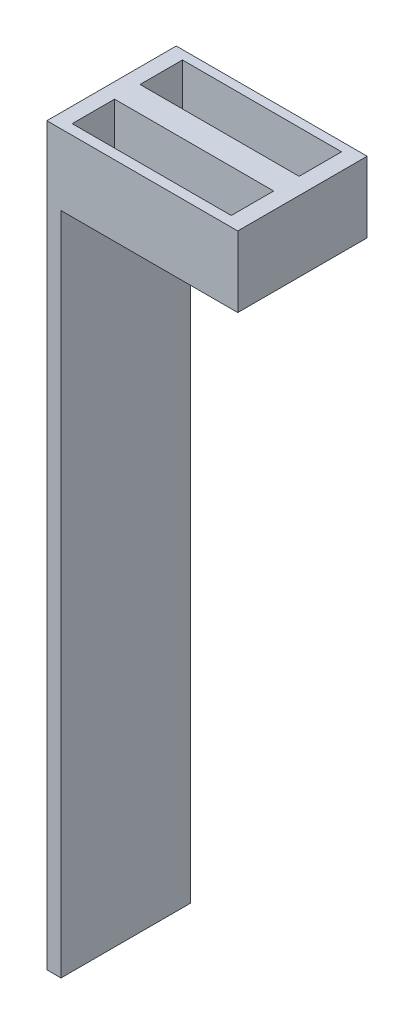
ISO-10303-21;
HEADER;
FILE_DESCRIPTION(('STEP AP214'),'2;1');
FILE_NAME('part.step','',(''),(''),'','','');
FILE_SCHEMA(('AUTOMOTIVE_DESIGN { 1 0 10303 214 1 1 1 1 }'));
ENDSEC;
DATA;
#1=APPLICATION_CONTEXT('core data for automotive mechanical design processes');
#2=APPLICATION_PROTOCOL_DEFINITION('international standard','automotive_design',2000,#1);
#3=PRODUCT_CONTEXT('',#1,'mechanical');
#4=PRODUCT('Part','Part','',(#3));
#5=PRODUCT_RELATED_PRODUCT_CATEGORY('part','',(#4));
#6=PRODUCT_DEFINITION_FORMATION('','',#4);
#7=PRODUCT_DEFINITION_CONTEXT('part definition',#1,'design');
#8=PRODUCT_DEFINITION('design','',#6,#7);
#9=PRODUCT_DEFINITION_SHAPE('','',#8);
#10=(LENGTH_UNIT() NAMED_UNIT(*) SI_UNIT(.MILLI.,.METRE.));
#11=(NAMED_UNIT(*) PLANE_ANGLE_UNIT() SI_UNIT($,.RADIAN.));
#12=(NAMED_UNIT(*) SI_UNIT($,.STERADIAN.) SOLID_ANGLE_UNIT());
#13=UNCERTAINTY_MEASURE_WITH_UNIT(LENGTH_MEASURE(1.E-05),#10,'distance_accuracy_value','');
#14=(GEOMETRIC_REPRESENTATION_CONTEXT(3) GLOBAL_UNCERTAINTY_ASSIGNED_CONTEXT((#13)) GLOBAL_UNIT_ASSIGNED_CONTEXT((#10,
#11,#12)) REPRESENTATION_CONTEXT('',''));
#15=CARTESIAN_POINT('',(0.,0.,0.));
#16=DIRECTION('',(0.,0.,1.));
#17=DIRECTION('',(1.,0.,0.));
#18=AXIS2_PLACEMENT_3D('',#15,#16,#17);
#19=CARTESIAN_POINT('',(13.5,10.,9.15));
#20=DIRECTION('',(-1.,0.,0.));
#21=DIRECTION('',(0.,0.,1.));
#22=AXIS2_PLACEMENT_3D('',#19,#20,#21);
#23=PLANE('',#22);
#24=DIRECTION('',(0.,0.,-1.));
#25=VECTOR('',#24,1.);
#26=CARTESIAN_POINT('',(13.5,0.,9.15));
#27=LINE('',#26,#25);
#28=CARTESIAN_POINT('',(13.5,0.,9.15));
#29=VERTEX_POINT('',#28);
#30=CARTESIAN_POINT('',(13.5,0.,-9.15));
#31=VERTEX_POINT('',#30);
#32=EDGE_CURVE('E220',#29,#31,#27,.T.);
#33=ORIENTED_EDGE('',*,*,#32,.T.);
#34=DIRECTION('',(0.,-1.,0.));
#35=VECTOR('',#34,1.);
#36=CARTESIAN_POINT('',(13.5,10.,-9.15));
#37=LINE('',#36,#35);
#38=CARTESIAN_POINT('',(13.5,10.,-9.15));
#39=VERTEX_POINT('',#38);
#40=EDGE_CURVE('E11',#39,#31,#37,.T.);
#41=ORIENTED_EDGE('',*,*,#40,.F.);
#42=DIRECTION('',(0.,0.,-1.));
#43=VECTOR('',#42,1.);
#44=CARTESIAN_POINT('',(13.5,10.,9.15));
#45=LINE('',#44,#43);
#46=CARTESIAN_POINT('',(13.5,10.,9.15));
#47=VERTEX_POINT('',#46);
#48=EDGE_CURVE('E272',#47,#39,#45,.T.);
#49=ORIENTED_EDGE('',*,*,#48,.F.);
#50=DIRECTION('',(0.,-1.,0.));
#51=VECTOR('',#50,1.);
#52=CARTESIAN_POINT('',(13.5,10.,9.15));
#53=LINE('',#52,#51);
#54=EDGE_CURVE('E285',#47,#29,#53,.T.);
#55=ORIENTED_EDGE('',*,*,#54,.T.);
#56=EDGE_LOOP('',(#33,#41,#49,#55));
#57=FACE_BOUND('',#56,.T.);
#58=ADVANCED_FACE('F45',(#57),#23,.F.);
#59=CARTESIAN_POINT('',(-13.5,10.,-9.15));
#60=DIRECTION('',(0.,0.,1.));
#61=DIRECTION('',(1.,0.,0.));
#62=AXIS2_PLACEMENT_3D('',#59,#60,#61);
#63=PLANE('',#62);
#64=DIRECTION('',(-1.,0.,0.));
#65=VECTOR('',#64,1.);
#66=CARTESIAN_POINT('',(-13.5,0.,-9.15));
#67=LINE('',#66,#65);
#68=CARTESIAN_POINT('',(-11.5,0.,-9.15));
#69=VERTEX_POINT('',#68);
#70=EDGE_CURVE('E289',#31,#69,#67,.T.);
#71=ORIENTED_EDGE('',*,*,#70,.T.);
#72=DIRECTION('',(0.,1.,0.));
#73=VECTOR('',#72,1.);
#74=CARTESIAN_POINT('',(-11.5,-94.,-9.15));
#75=LINE('',#74,#73);
#76=CARTESIAN_POINT('',(-11.5,-94.,-9.15));
#77=VERTEX_POINT('',#76);
#78=EDGE_CURVE('E160',#77,#69,#75,.T.);
#79=ORIENTED_EDGE('',*,*,#78,.F.);
#80=DIRECTION('',(1.,0.,0.));
#81=VECTOR('',#80,1.);
#82=CARTESIAN_POINT('',(-13.5,-94.,-9.15));
#83=LINE('',#82,#81);
#84=CARTESIAN_POINT('',(-13.5,-94.,-9.15));
#85=VERTEX_POINT('',#84);
#86=EDGE_CURVE('E157',#85,#77,#83,.T.);
#87=ORIENTED_EDGE('',*,*,#86,.F.);
#88=DIRECTION('',(0.,-1.,0.));
#89=VECTOR('',#88,1.);
#90=CARTESIAN_POINT('',(-13.5,10.,-9.15));
#91=LINE('',#90,#89);
#92=CARTESIAN_POINT('',(-13.5,10.,-9.15));
#93=VERTEX_POINT('',#92);
#94=EDGE_CURVE('E53',#93,#85,#91,.T.);
#95=ORIENTED_EDGE('',*,*,#94,.F.);
#96=DIRECTION('',(-1.,0.,0.));
#97=VECTOR('',#96,1.);
#98=CARTESIAN_POINT('',(-13.5,10.,-9.15));
#99=LINE('',#98,#97);
#100=EDGE_CURVE('E276',#39,#93,#99,.T.);
#101=ORIENTED_EDGE('',*,*,#100,.F.);
#102=ORIENTED_EDGE('',*,*,#40,.T.);
#103=EDGE_LOOP('',(#71,#79,#87,#95,#101,#102));
#104=FACE_BOUND('',#103,.T.);
#105=ADVANCED_FACE('F158',(#104),#63,.F.);
#106=CARTESIAN_POINT('',(-13.5,10.,9.15));
#107=DIRECTION('',(1.,0.,0.));
#108=DIRECTION('',(0.,0.,-1.));
#109=AXIS2_PLACEMENT_3D('',#106,#107,#108);
#110=PLANE('',#109);
#111=ORIENTED_EDGE('',*,*,#94,.T.);
#112=DIRECTION('',(0.,0.,-1.));
#113=VECTOR('',#112,1.);
#114=CARTESIAN_POINT('',(-13.5,-94.,9.15));
#115=LINE('',#114,#113);
#116=CARTESIAN_POINT('',(-13.5,-94.,9.15));
#117=VERTEX_POINT('',#116);
#118=EDGE_CURVE('E151',#117,#85,#115,.T.);
#119=ORIENTED_EDGE('',*,*,#118,.F.);
#120=DIRECTION('',(0.,-1.,0.));
#121=VECTOR('',#120,1.);
#122=CARTESIAN_POINT('',(-13.5,10.,9.15));
#123=LINE('',#122,#121);
#124=CARTESIAN_POINT('',(-13.5,10.,9.15));
#125=VERTEX_POINT('',#124);
#126=EDGE_CURVE('E155',#125,#117,#123,.T.);
#127=ORIENTED_EDGE('',*,*,#126,.F.);
#128=DIRECTION('',(0.,0.,1.));
#129=VECTOR('',#128,1.);
#130=CARTESIAN_POINT('',(-13.5,10.,9.15));
#131=LINE('',#130,#129);
#132=EDGE_CURVE('E152',#93,#125,#131,.T.);
#133=ORIENTED_EDGE('',*,*,#132,.F.);
#134=EDGE_LOOP('',(#111,#119,#127,#133));
#135=FACE_BOUND('',#134,.T.);
#136=ADVANCED_FACE('F148',(#135),#110,.F.);
#137=CARTESIAN_POINT('',(-13.5,10.,9.15));
#138=DIRECTION('',(0.,0.,-1.));
#139=DIRECTION('',(-1.,0.,0.));
#140=AXIS2_PLACEMENT_3D('',#137,#138,#139);
#141=PLANE('',#140);
#142=ORIENTED_EDGE('',*,*,#126,.T.);
#143=DIRECTION('',(-1.,0.,0.));
#144=VECTOR('',#143,1.);
#145=CARTESIAN_POINT('',(-13.5,-94.,9.15));
#146=LINE('',#145,#144);
#147=CARTESIAN_POINT('',(-11.5,-94.,9.15));
#148=VERTEX_POINT('',#147);
#149=EDGE_CURVE('E169',#148,#117,#146,.T.);
#150=ORIENTED_EDGE('',*,*,#149,.F.);
#151=DIRECTION('',(0.,1.,0.));
#152=VECTOR('',#151,1.);
#153=CARTESIAN_POINT('',(-11.5,-94.,9.15));
#154=LINE('',#153,#152);
#155=CARTESIAN_POINT('',(-11.5,0.,9.15));
#156=VERTEX_POINT('',#155);
#157=EDGE_CURVE('E178',#148,#156,#154,.T.);
#158=ORIENTED_EDGE('',*,*,#157,.T.);
#159=DIRECTION('',(1.,0.,0.));
#160=VECTOR('',#159,1.);
#161=CARTESIAN_POINT('',(-13.5,0.,9.15));
#162=LINE('',#161,#160);
#163=EDGE_CURVE('E277',#156,#29,#162,.T.);
#164=ORIENTED_EDGE('',*,*,#163,.T.);
#165=ORIENTED_EDGE('',*,*,#54,.F.);
#166=DIRECTION('',(1.,0.,0.));
#167=VECTOR('',#166,1.);
#168=CARTESIAN_POINT('',(-13.5,10.,9.15));
#169=LINE('',#168,#167);
#170=EDGE_CURVE('E282',#125,#47,#169,.T.);
#171=ORIENTED_EDGE('',*,*,#170,.F.);
#172=EDGE_LOOP('',(#142,#150,#158,#164,#165,#171));
#173=FACE_BOUND('',#172,.T.);
#174=ADVANCED_FACE('F300',(#173),#141,.F.);
#175=CARTESIAN_POINT('',(0.,10.,0.));
#176=DIRECTION('',(0.,-1.,0.));
#177=DIRECTION('',(0.,0.,-1.));
#178=AXIS2_PLACEMENT_3D('',#175,#176,#177);
#179=PLANE('',#178);
#180=DIRECTION('',(-1.,0.,0.));
#181=VECTOR('',#180,1.);
#182=CARTESIAN_POINT('',(-11.35,10.,-1.88));
#183=LINE('',#182,#181);
#184=CARTESIAN_POINT('',(11.15,10.,-1.88));
#185=VERTEX_POINT('',#184);
#186=CARTESIAN_POINT('',(-11.35,10.,-1.88));
#187=VERTEX_POINT('',#186);
#188=EDGE_CURVE('E197',#185,#187,#183,.T.);
#189=ORIENTED_EDGE('',*,*,#188,.T.);
#190=DIRECTION('',(0.,0.,-1.));
#191=VECTOR('',#190,1.);
#192=CARTESIAN_POINT('',(-11.35,10.,-1.88));
#193=LINE('',#192,#191);
#194=CARTESIAN_POINT('',(-11.35,10.,-7.88));
#195=VERTEX_POINT('',#194);
#196=EDGE_CURVE('E186',#187,#195,#193,.T.);
#197=ORIENTED_EDGE('',*,*,#196,.T.);
#198=DIRECTION('',(1.,0.,0.));
#199=VECTOR('',#198,1.);
#200=CARTESIAN_POINT('',(-11.35,10.,-7.88));
#201=LINE('',#200,#199);
#202=CARTESIAN_POINT('',(11.15,10.,-7.88));
#203=VERTEX_POINT('',#202);
#204=EDGE_CURVE('E190',#195,#203,#201,.T.);
#205=ORIENTED_EDGE('',*,*,#204,.T.);
#206=DIRECTION('',(0.,0.,1.));
#207=VECTOR('',#206,1.);
#208=CARTESIAN_POINT('',(11.15,10.,-1.88));
#209=LINE('',#208,#207);
#210=EDGE_CURVE('E68',#203,#185,#209,.T.);
#211=ORIENTED_EDGE('',*,*,#210,.T.);
#212=EDGE_LOOP('',(#189,#197,#205,#211));
#213=FACE_BOUND('',#212,.T.);
#214=DIRECTION('',(-1.,0.,0.));
#215=VECTOR('',#214,1.);
#216=CARTESIAN_POINT('',(-11.35,10.,7.72));
#217=LINE('',#216,#215);
#218=CARTESIAN_POINT('',(11.15,10.,7.72));
#219=VERTEX_POINT('',#218);
#220=CARTESIAN_POINT('',(-11.35,10.,7.72));
#221=VERTEX_POINT('',#220);
#222=EDGE_CURVE('E234',#219,#221,#217,.T.);
#223=ORIENTED_EDGE('',*,*,#222,.T.);
#224=DIRECTION('',(0.,0.,-1.));
#225=VECTOR('',#224,1.);
#226=CARTESIAN_POINT('',(-11.35,10.,7.72));
#227=LINE('',#226,#225);
#228=CARTESIAN_POINT('',(-11.35,10.,1.72));
#229=VERTEX_POINT('',#228);
#230=EDGE_CURVE('E248',#221,#229,#227,.T.);
#231=ORIENTED_EDGE('',*,*,#230,.T.);
#232=DIRECTION('',(1.,0.,0.));
#233=VECTOR('',#232,1.);
#234=CARTESIAN_POINT('',(-11.35,10.,1.72));
#235=LINE('',#234,#233);
#236=CARTESIAN_POINT('',(11.15,10.,1.72));
#237=VERTEX_POINT('',#236);
#238=EDGE_CURVE('E265',#229,#237,#235,.T.);
#239=ORIENTED_EDGE('',*,*,#238,.T.);
#240=DIRECTION('',(0.,0.,1.));
#241=VECTOR('',#240,1.);
#242=CARTESIAN_POINT('',(11.15,10.,7.72));
#243=LINE('',#242,#241);
#244=EDGE_CURVE('E261',#237,#219,#243,.T.);
#245=ORIENTED_EDGE('',*,*,#244,.T.);
#246=EDGE_LOOP('',(#223,#231,#239,#245));
#247=FACE_BOUND('',#246,.T.);
#248=ORIENTED_EDGE('',*,*,#48,.T.);
#249=ORIENTED_EDGE('',*,*,#100,.T.);
#250=ORIENTED_EDGE('',*,*,#132,.T.);
#251=ORIENTED_EDGE('',*,*,#170,.T.);
#252=EDGE_LOOP('',(#248,#249,#250,#251));
#253=FACE_BOUND('',#252,.T.);
#254=ADVANCED_FACE('F304',(#213,#247,#253),#179,.F.);
#255=CARTESIAN_POINT('',(0.,0.,0.));
#256=DIRECTION('',(0.,-1.,0.));
#257=DIRECTION('',(0.,0.,-1.));
#258=AXIS2_PLACEMENT_3D('',#255,#256,#257);
#259=PLANE('',#258);
#260=DIRECTION('',(0.,0.,1.));
#261=VECTOR('',#260,1.);
#262=CARTESIAN_POINT('',(-11.5,0.,9.15));
#263=LINE('',#262,#261);
#264=EDGE_CURVE('E60',#69,#156,#263,.T.);
#265=ORIENTED_EDGE('',*,*,#264,.F.);
#266=ORIENTED_EDGE('',*,*,#70,.F.);
#267=ORIENTED_EDGE('',*,*,#32,.F.);
#268=ORIENTED_EDGE('',*,*,#163,.F.);
#269=EDGE_LOOP('',(#265,#266,#267,#268));
#270=FACE_BOUND('',#269,.T.);
#271=DIRECTION('',(0.,0.,-1.));
#272=VECTOR('',#271,1.);
#273=CARTESIAN_POINT('',(-11.35,0.,-1.88));
#274=LINE('',#273,#272);
#275=CARTESIAN_POINT('',(-11.35,0.,-1.88));
#276=VERTEX_POINT('',#275);
#277=CARTESIAN_POINT('',(-11.35,0.,-7.88));
#278=VERTEX_POINT('',#277);
#279=EDGE_CURVE('E202',#276,#278,#274,.T.);
#280=ORIENTED_EDGE('',*,*,#279,.F.);
#281=DIRECTION('',(-1.,0.,0.));
#282=VECTOR('',#281,1.);
#283=CARTESIAN_POINT('',(-11.35,0.,-1.88));
#284=LINE('',#283,#282);
#285=CARTESIAN_POINT('',(11.15,0.,-1.88));
#286=VERTEX_POINT('',#285);
#287=EDGE_CURVE('E191',#286,#276,#284,.T.);
#288=ORIENTED_EDGE('',*,*,#287,.F.);
#289=DIRECTION('',(0.,0.,1.));
#290=VECTOR('',#289,1.);
#291=CARTESIAN_POINT('',(11.15,0.,-1.88));
#292=LINE('',#291,#290);
#293=CARTESIAN_POINT('',(11.15,0.,-7.88));
#294=VERTEX_POINT('',#293);
#295=EDGE_CURVE('E210',#294,#286,#292,.T.);
#296=ORIENTED_EDGE('',*,*,#295,.F.);
#297=DIRECTION('',(1.,0.,0.));
#298=VECTOR('',#297,1.);
#299=CARTESIAN_POINT('',(-11.35,0.,-7.88));
#300=LINE('',#299,#298);
#301=EDGE_CURVE('E205',#278,#294,#300,.T.);
#302=ORIENTED_EDGE('',*,*,#301,.F.);
#303=EDGE_LOOP('',(#280,#288,#296,#302));
#304=FACE_BOUND('',#303,.T.);
#305=DIRECTION('',(0.,0.,-1.));
#306=VECTOR('',#305,1.);
#307=CARTESIAN_POINT('',(-11.35,0.,7.72));
#308=LINE('',#307,#306);
#309=CARTESIAN_POINT('',(-11.35,0.,7.72));
#310=VERTEX_POINT('',#309);
#311=CARTESIAN_POINT('',(-11.35,0.,1.72));
#312=VERTEX_POINT('',#311);
#313=EDGE_CURVE('E206',#310,#312,#308,.T.);
#314=ORIENTED_EDGE('',*,*,#313,.F.);
#315=DIRECTION('',(-1.,0.,0.));
#316=VECTOR('',#315,1.);
#317=CARTESIAN_POINT('',(-11.35,0.,7.72));
#318=LINE('',#317,#316);
#319=CARTESIAN_POINT('',(11.15,0.,7.72));
#320=VERTEX_POINT('',#319);
#321=EDGE_CURVE('E243',#320,#310,#318,.T.);
#322=ORIENTED_EDGE('',*,*,#321,.F.);
#323=DIRECTION('',(0.,0.,1.));
#324=VECTOR('',#323,1.);
#325=CARTESIAN_POINT('',(11.15,0.,7.72));
#326=LINE('',#325,#324);
#327=CARTESIAN_POINT('',(11.15,0.,1.72));
#328=VERTEX_POINT('',#327);
#329=EDGE_CURVE('E247',#328,#320,#326,.T.);
#330=ORIENTED_EDGE('',*,*,#329,.F.);
#331=DIRECTION('',(1.,0.,0.));
#332=VECTOR('',#331,1.);
#333=CARTESIAN_POINT('',(-11.35,0.,1.72));
#334=LINE('',#333,#332);
#335=EDGE_CURVE('E252',#312,#328,#334,.T.);
#336=ORIENTED_EDGE('',*,*,#335,.F.);
#337=EDGE_LOOP('',(#314,#322,#330,#336));
#338=FACE_BOUND('',#337,.T.);
#339=ADVANCED_FACE('F308',(#270,#304,#338),#259,.T.);
#340=CARTESIAN_POINT('',(-11.35,10.,7.72));
#341=DIRECTION('',(-1.,0.,0.));
#342=DIRECTION('',(0.,0.,1.));
#343=AXIS2_PLACEMENT_3D('',#340,#341,#342);
#344=PLANE('',#343);
#345=ORIENTED_EDGE('',*,*,#313,.T.);
#346=DIRECTION('',(0.,-1.,0.));
#347=VECTOR('',#346,1.);
#348=CARTESIAN_POINT('',(-11.35,10.,1.72));
#349=LINE('',#348,#347);
#350=EDGE_CURVE('E230',#229,#312,#349,.T.);
#351=ORIENTED_EDGE('',*,*,#350,.F.);
#352=ORIENTED_EDGE('',*,*,#230,.F.);
#353=DIRECTION('',(0.,-1.,0.));
#354=VECTOR('',#353,1.);
#355=CARTESIAN_POINT('',(-11.35,10.,7.72));
#356=LINE('',#355,#354);
#357=EDGE_CURVE('E185',#221,#310,#356,.T.);
#358=ORIENTED_EDGE('',*,*,#357,.T.);
#359=EDGE_LOOP('',(#345,#351,#352,#358));
#360=FACE_BOUND('',#359,.T.);
#361=ADVANCED_FACE('F339',(#360),#344,.F.);
#362=CARTESIAN_POINT('',(-11.35,10.,7.72));
#363=DIRECTION('',(0.,0.,1.));
#364=DIRECTION('',(1.,0.,0.));
#365=AXIS2_PLACEMENT_3D('',#362,#363,#364);
#366=PLANE('',#365);
#367=ORIENTED_EDGE('',*,*,#321,.T.);
#368=ORIENTED_EDGE('',*,*,#357,.F.);
#369=ORIENTED_EDGE('',*,*,#222,.F.);
#370=DIRECTION('',(0.,-1.,0.));
#371=VECTOR('',#370,1.);
#372=CARTESIAN_POINT('',(11.15,10.,7.72));
#373=LINE('',#372,#371);
#374=EDGE_CURVE('E238',#219,#320,#373,.T.);
#375=ORIENTED_EDGE('',*,*,#374,.T.);
#376=EDGE_LOOP('',(#367,#368,#369,#375));
#377=FACE_BOUND('',#376,.T.);
#378=ADVANCED_FACE('F342',(#377),#366,.F.);
#379=CARTESIAN_POINT('',(11.15,10.,7.72));
#380=DIRECTION('',(1.,0.,0.));
#381=DIRECTION('',(0.,0.,-1.));
#382=AXIS2_PLACEMENT_3D('',#379,#380,#381);
#383=PLANE('',#382);
#384=ORIENTED_EDGE('',*,*,#329,.T.);
#385=ORIENTED_EDGE('',*,*,#374,.F.);
#386=ORIENTED_EDGE('',*,*,#244,.F.);
#387=DIRECTION('',(0.,-1.,0.));
#388=VECTOR('',#387,1.);
#389=CARTESIAN_POINT('',(11.15,10.,1.72));
#390=LINE('',#389,#388);
#391=EDGE_CURVE('E235',#237,#328,#390,.T.);
#392=ORIENTED_EDGE('',*,*,#391,.T.);
#393=EDGE_LOOP('',(#384,#385,#386,#392));
#394=FACE_BOUND('',#393,.T.);
#395=ADVANCED_FACE('F345',(#394),#383,.F.);
#396=CARTESIAN_POINT('',(-11.35,10.,1.72));
#397=DIRECTION('',(0.,0.,-1.));
#398=DIRECTION('',(-1.,0.,0.));
#399=AXIS2_PLACEMENT_3D('',#396,#397,#398);
#400=PLANE('',#399);
#401=ORIENTED_EDGE('',*,*,#335,.T.);
#402=ORIENTED_EDGE('',*,*,#391,.F.);
#403=ORIENTED_EDGE('',*,*,#238,.F.);
#404=ORIENTED_EDGE('',*,*,#350,.T.);
#405=EDGE_LOOP('',(#401,#402,#403,#404));
#406=FACE_BOUND('',#405,.T.);
#407=ADVANCED_FACE('F349',(#406),#400,.F.);
#408=CARTESIAN_POINT('',(-11.35,10.,-1.88));
#409=DIRECTION('',(-1.,0.,0.));
#410=DIRECTION('',(0.,0.,1.));
#411=AXIS2_PLACEMENT_3D('',#408,#409,#410);
#412=PLANE('',#411);
#413=ORIENTED_EDGE('',*,*,#279,.T.);
#414=DIRECTION('',(0.,-1.,0.));
#415=VECTOR('',#414,1.);
#416=CARTESIAN_POINT('',(-11.35,10.,-7.88));
#417=LINE('',#416,#415);
#418=EDGE_CURVE('E201',#195,#278,#417,.T.);
#419=ORIENTED_EDGE('',*,*,#418,.F.);
#420=ORIENTED_EDGE('',*,*,#196,.F.);
#421=DIRECTION('',(0.,-1.,0.));
#422=VECTOR('',#421,1.);
#423=CARTESIAN_POINT('',(-11.35,10.,-1.88));
#424=LINE('',#423,#422);
#425=EDGE_CURVE('E217',#187,#276,#424,.T.);
#426=ORIENTED_EDGE('',*,*,#425,.T.);
#427=EDGE_LOOP('',(#413,#419,#420,#426));
#428=FACE_BOUND('',#427,.T.);
#429=ADVANCED_FACE('F353',(#428),#412,.F.);
#430=CARTESIAN_POINT('',(-11.35,10.,-1.88));
#431=DIRECTION('',(0.,0.,1.));
#432=DIRECTION('',(1.,0.,0.));
#433=AXIS2_PLACEMENT_3D('',#430,#431,#432);
#434=PLANE('',#433);
#435=ORIENTED_EDGE('',*,*,#287,.T.);
#436=ORIENTED_EDGE('',*,*,#425,.F.);
#437=ORIENTED_EDGE('',*,*,#188,.F.);
#438=DIRECTION('',(0.,-1.,0.));
#439=VECTOR('',#438,1.);
#440=CARTESIAN_POINT('',(11.15,10.,-1.88));
#441=LINE('',#440,#439);
#442=EDGE_CURVE('E221',#185,#286,#441,.T.);
#443=ORIENTED_EDGE('',*,*,#442,.T.);
#444=EDGE_LOOP('',(#435,#436,#437,#443));
#445=FACE_BOUND('',#444,.T.);
#446=ADVANCED_FACE('F359',(#445),#434,.F.);
#447=CARTESIAN_POINT('',(11.15,10.,-1.88));
#448=DIRECTION('',(1.,0.,0.));
#449=DIRECTION('',(0.,0.,-1.));
#450=AXIS2_PLACEMENT_3D('',#447,#448,#449);
#451=PLANE('',#450);
#452=ORIENTED_EDGE('',*,*,#295,.T.);
#453=ORIENTED_EDGE('',*,*,#442,.F.);
#454=ORIENTED_EDGE('',*,*,#210,.F.);
#455=DIRECTION('',(0.,-1.,0.));
#456=VECTOR('',#455,1.);
#457=CARTESIAN_POINT('',(11.15,10.,-7.88));
#458=LINE('',#457,#456);
#459=EDGE_CURVE('E224',#203,#294,#458,.T.);
#460=ORIENTED_EDGE('',*,*,#459,.T.);
#461=EDGE_LOOP('',(#452,#453,#454,#460));
#462=FACE_BOUND('',#461,.T.);
#463=ADVANCED_FACE('F322',(#462),#451,.F.);
#464=CARTESIAN_POINT('',(-11.35,10.,-7.88));
#465=DIRECTION('',(0.,0.,-1.));
#466=DIRECTION('',(-1.,0.,0.));
#467=AXIS2_PLACEMENT_3D('',#464,#465,#466);
#468=PLANE('',#467);
#469=ORIENTED_EDGE('',*,*,#301,.T.);
#470=ORIENTED_EDGE('',*,*,#459,.F.);
#471=ORIENTED_EDGE('',*,*,#204,.F.);
#472=ORIENTED_EDGE('',*,*,#418,.T.);
#473=EDGE_LOOP('',(#469,#470,#471,#472));
#474=FACE_BOUND('',#473,.T.);
#475=ADVANCED_FACE('F314',(#474),#468,.F.);
#476=CARTESIAN_POINT('',(-11.5,-94.,9.15));
#477=DIRECTION('',(-1.,0.,0.));
#478=DIRECTION('',(0.,0.,1.));
#479=AXIS2_PLACEMENT_3D('',#476,#477,#478);
#480=PLANE('',#479);
#481=ORIENTED_EDGE('',*,*,#264,.T.);
#482=ORIENTED_EDGE('',*,*,#157,.F.);
#483=DIRECTION('',(0.,0.,1.));
#484=VECTOR('',#483,1.);
#485=CARTESIAN_POINT('',(-11.5,-94.,9.15));
#486=LINE('',#485,#484);
#487=EDGE_CURVE('E164',#77,#148,#486,.T.);
#488=ORIENTED_EDGE('',*,*,#487,.F.);
#489=ORIENTED_EDGE('',*,*,#78,.T.);
#490=EDGE_LOOP('',(#481,#482,#488,#489));
#491=FACE_BOUND('',#490,.T.);
#492=ADVANCED_FACE('F312',(#491),#480,.F.);
#493=CARTESIAN_POINT('',(0.,-94.,0.));
#494=DIRECTION('',(0.,-1.,0.));
#495=DIRECTION('',(0.,0.,-1.));
#496=AXIS2_PLACEMENT_3D('',#493,#494,#495);
#497=PLANE('',#496);
#498=ORIENTED_EDGE('',*,*,#118,.T.);
#499=ORIENTED_EDGE('',*,*,#86,.T.);
#500=ORIENTED_EDGE('',*,*,#487,.T.);
#501=ORIENTED_EDGE('',*,*,#149,.T.);
#502=EDGE_LOOP('',(#498,#499,#500,#501));
#503=FACE_BOUND('',#502,.T.);
#504=ADVANCED_FACE('F167',(#503),#497,.T.);
#505=CLOSED_SHELL('',(#58,#105,#136,#174,#254,#339,#361,#378,#395,#407,#429,#446,#463,#475,#492,#504));
#506=MANIFOLD_SOLID_BREP('B2',#505);
#507=ADVANCED_BREP_SHAPE_REPRESENTATION('',(#18,#506),#14);
#508=SHAPE_DEFINITION_REPRESENTATION(#9,#507);
ENDSEC;
END-ISO-10303-21;
